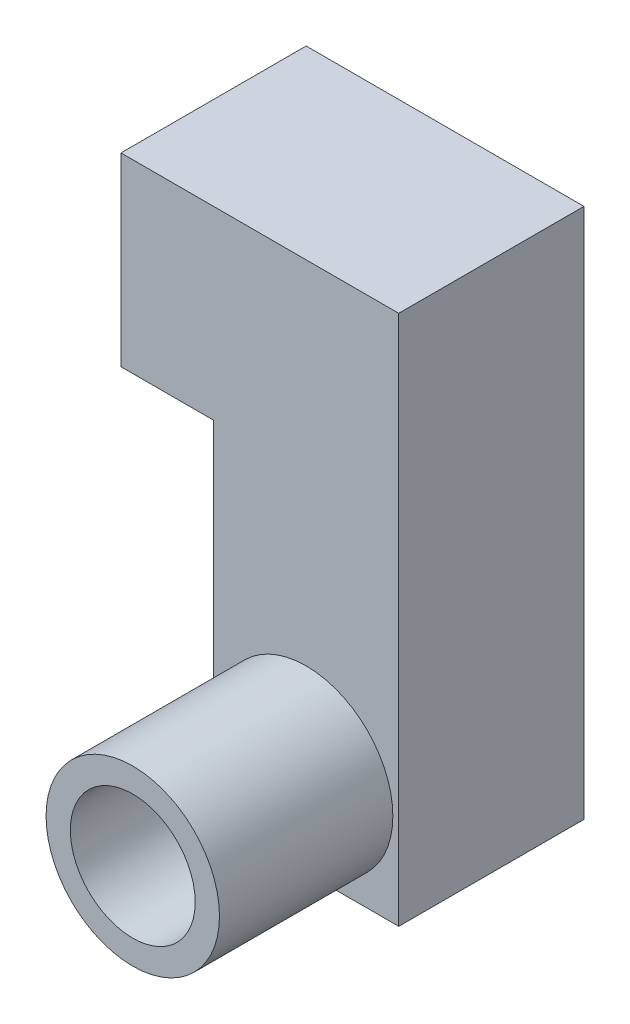
ISO-10303-21;
HEADER;
FILE_DESCRIPTION(('STEP AP214'),'2;1');
FILE_NAME('part.step','',(''),(''),'','','');
FILE_SCHEMA(('AUTOMOTIVE_DESIGN { 1 0 10303 214 1 1 1 1 }'));
ENDSEC;
DATA;
#1=APPLICATION_CONTEXT('core data for automotive mechanical design processes');
#2=APPLICATION_PROTOCOL_DEFINITION('international standard','automotive_design',2000,#1);
#3=PRODUCT_CONTEXT('',#1,'mechanical');
#4=PRODUCT('Part','Part','',(#3));
#5=PRODUCT_RELATED_PRODUCT_CATEGORY('part','',(#4));
#6=PRODUCT_DEFINITION_FORMATION('','',#4);
#7=PRODUCT_DEFINITION_CONTEXT('part definition',#1,'design');
#8=PRODUCT_DEFINITION('design','',#6,#7);
#9=PRODUCT_DEFINITION_SHAPE('','',#8);
#10=(LENGTH_UNIT() NAMED_UNIT(*) SI_UNIT(.MILLI.,.METRE.));
#11=(NAMED_UNIT(*) PLANE_ANGLE_UNIT() SI_UNIT($,.RADIAN.));
#12=(NAMED_UNIT(*) SI_UNIT($,.STERADIAN.) SOLID_ANGLE_UNIT());
#13=UNCERTAINTY_MEASURE_WITH_UNIT(LENGTH_MEASURE(1.E-05),#10,'distance_accuracy_value','');
#14=(GEOMETRIC_REPRESENTATION_CONTEXT(3) GLOBAL_UNCERTAINTY_ASSIGNED_CONTEXT((#13)) GLOBAL_UNIT_ASSIGNED_CONTEXT((#10,
#11,#12)) REPRESENTATION_CONTEXT('',''));
#15=CARTESIAN_POINT('',(0.,0.,0.));
#16=DIRECTION('',(0.,0.,1.));
#17=DIRECTION('',(1.,0.,0.));
#18=AXIS2_PLACEMENT_3D('',#15,#16,#17);
#19=CARTESIAN_POINT('',(0.,0.,-9.65));
#20=DIRECTION('',(0.,0.,1.));
#21=DIRECTION('',(1.,0.,0.));
#22=AXIS2_PLACEMENT_3D('',#19,#20,#21);
#23=CYLINDRICAL_SURFACE('',#22,9.);
#24=CARTESIAN_POINT('',(0.,0.,-9.65));
#25=DIRECTION('',(0.,0.,1.));
#26=DIRECTION('',(1.,0.,0.));
#27=AXIS2_PLACEMENT_3D('',#24,#25,#26);
#28=CIRCLE('',#27,9.);
#29=CARTESIAN_POINT('',(9.,0.,-9.65));
#30=VERTEX_POINT('',#29);
#31=EDGE_CURVE('E106',#30,#30,#28,.T.);
#32=ORIENTED_EDGE('',*,*,#31,.F.);
#33=EDGE_LOOP('',(#32));
#34=FACE_BOUND('',#33,.T.);
#35=CARTESIAN_POINT('',(0.,0.,0.));
#36=DIRECTION('',(0.,-0.707106781186547,0.707106781186548));
#37=DIRECTION('',(0.,0.707106781186547,0.707106781186548));
#38=AXIS2_PLACEMENT_3D('',#35,#36,#37);
#39=ELLIPSE('',#38,12.7279220613579,9.);
#40=CARTESIAN_POINT('',(9.,0.,0.));
#41=VERTEX_POINT('',#40);
#42=CARTESIAN_POINT('',(-9.,0.,0.));
#43=VERTEX_POINT('',#42);
#44=EDGE_CURVE('E49',#41,#43,#39,.T.);
#45=ORIENTED_EDGE('',*,*,#44,.F.);
#46=CARTESIAN_POINT('',(0.,0.,0.));
#47=DIRECTION('',(0.,0.707106781186547,0.707106781186548));
#48=DIRECTION('',(0.,-0.707106781186547,0.707106781186548));
#49=AXIS2_PLACEMENT_3D('',#46,#47,#48);
#50=ELLIPSE('',#49,12.7279220613579,9.);
#51=EDGE_CURVE('E93',#43,#41,#50,.F.);
#52=ORIENTED_EDGE('',*,*,#51,.F.);
#53=EDGE_LOOP('',(#45,#52));
#54=FACE_BOUND('',#53,.T.);
#55=CARTESIAN_POINT('',(0.,0.,38.35));
#56=DIRECTION('',(0.,0.,1.));
#57=DIRECTION('',(1.,0.,0.));
#58=AXIS2_PLACEMENT_3D('',#55,#56,#57);
#59=CIRCLE('',#58,9.);
#60=CARTESIAN_POINT('',(9.,0.,38.35));
#61=VERTEX_POINT('',#60);
#62=EDGE_CURVE('E235',#61,#61,#59,.T.);
#63=ORIENTED_EDGE('',*,*,#62,.T.);
#64=EDGE_LOOP('',(#63));
#65=FACE_BOUND('',#64,.T.);
#66=ADVANCED_FACE('F33',(#34,#54,#65),#23,.F.);
#67=CARTESIAN_POINT('',(9.,49.85,0.));
#68=DIRECTION('',(-1.,0.,0.));
#69=DIRECTION('',(0.,0.,1.));
#70=AXIS2_PLACEMENT_3D('',#67,#68,#69);
#71=CYLINDRICAL_SURFACE('',#70,11.5);
#72=CARTESIAN_POINT('',(-26.7,49.85,0.));
#73=DIRECTION('',(-1.,0.,0.));
#74=DIRECTION('',(0.,0.,1.));
#75=AXIS2_PLACEMENT_3D('',#72,#73,#74);
#76=CIRCLE('',#75,11.5);
#77=CARTESIAN_POINT('',(-26.7,49.85,11.5));
#78=VERTEX_POINT('',#77);
#79=EDGE_CURVE('E98',#78,#78,#76,.T.);
#80=ORIENTED_EDGE('',*,*,#79,.T.);
#81=EDGE_LOOP('',(#80));
#82=FACE_BOUND('',#81,.T.);
#83=CARTESIAN_POINT('',(9.,49.85,0.));
#84=DIRECTION('',(-1.,0.,0.));
#85=DIRECTION('',(0.,0.,1.));
#86=AXIS2_PLACEMENT_3D('',#83,#84,#85);
#87=CIRCLE('',#86,11.5);
#88=CARTESIAN_POINT('',(9.,38.35,0.));
#89=VERTEX_POINT('',#88);
#90=EDGE_CURVE('E101',#89,#89,#87,.T.);
#91=ORIENTED_EDGE('',*,*,#90,.F.);
#92=CARTESIAN_POINT('',(9.,38.35,0.));
#93=CARTESIAN_POINT('',(8.99999822327962,38.3500017273557,-0.217410044293531));
#94=CARTESIAN_POINT('',(8.9921082363085,38.356179395316,-0.434854105228076));
#95=CARTESIAN_POINT('',(8.96067876108795,38.3807511021865,-0.8680039294442));
#96=CARTESIAN_POINT('',(8.93713098780956,38.3991516085811,-1.08370871122784));
#97=CARTESIAN_POINT('',(8.87473673951324,38.4477822528311,-1.51193537286686));
#98=CARTESIAN_POINT('',(8.83586279429362,38.4780336312354,-1.72445082231631));
#99=CARTESIAN_POINT('',(8.74345195587784,38.5496857802098,-2.14435944926959));
#100=CARTESIAN_POINT('',(8.68991328585942,38.5910879018273,-2.35175200274618));
#101=CARTESIAN_POINT('',(8.56936575250363,38.6838655463068,-2.75875568885037));
#102=CARTESIAN_POINT('',(8.50244563499903,38.73517528858,-2.95840825210157));
#103=CARTESIAN_POINT('',(8.35579785571749,38.8469501844156,-3.35028625690186));
#104=CARTESIAN_POINT('',(8.27607011048031,38.9074153976389,-3.54251165004205));
#105=CARTESIAN_POINT('',(8.10472310325604,39.0364271676711,-3.9186956043603));
#106=CARTESIAN_POINT('',(8.01310660716111,39.1049718444714,-4.10265607499532));
#107=CARTESIAN_POINT('',(7.81882657789371,39.2490658118712,-4.46179905239505));
#108=CARTESIAN_POINT('',(7.71616111297857,39.3246163270136,-4.63698001632511));
#109=CARTESIAN_POINT('',(7.46422450471424,39.5081012278483,-5.03568867218174));
#110=CARTESIAN_POINT('',(7.31091065032274,39.6183656730867,-5.25560239585202));
#111=CARTESIAN_POINT('',(6.98759893165346,39.8468282675425,-5.67840984854964));
#112=CARTESIAN_POINT('',(6.81759593873014,39.9650288520213,-5.88129830988823));
#113=CARTESIAN_POINT('',(6.46174549978959,40.2070191575241,-6.27020741821287));
#114=CARTESIAN_POINT('',(6.27585737854124,40.3308228202649,-6.45618208323662));
#115=CARTESIAN_POINT('',(5.88955328470478,40.580957024231,-6.81042198083761));
#116=CARTESIAN_POINT('',(5.68913885632187,40.7072872958369,-6.97868909115035));
#117=CARTESIAN_POINT('',(5.27131455769504,40.9613086273188,-7.29956272598475));
#118=CARTESIAN_POINT('',(5.05370340890739,41.0889934670811,-7.45191229867028));
#119=CARTESIAN_POINT('',(4.60413379339249,41.3404008852973,-7.73776118692178));
#120=CARTESIAN_POINT('',(4.37217108126137,41.4641222747182,-7.87125488593252));
#121=CARTESIAN_POINT('',(3.89450138359598,41.7029447391882,-8.11818310252985));
#122=CARTESIAN_POINT('',(3.64883594867451,41.8180696371537,-8.23167433845495));
#123=CARTESIAN_POINT('',(3.14334983784952,42.0347290989592,-8.43764514874121));
#124=CARTESIAN_POINT('',(2.88354118756377,42.1362749623841,-8.53014223832434));
#125=CARTESIAN_POINT('',(2.30172980331531,42.3359494620844,-8.70689246697032));
#126=CARTESIAN_POINT('',(1.97693179665871,42.4301961260895,-8.78668891952417));
#127=CARTESIAN_POINT('',(1.47854353347439,42.5417970323273,-8.87932913492585));
#128=CARTESIAN_POINT('',(1.31067432990204,42.5740232481013,-8.90569082028775));
#129=CARTESIAN_POINT('',(0.97192521897398,42.6273471370681,-8.9489931393993));
#130=CARTESIAN_POINT('',(0.801045336252289,42.6484449012725,-8.96593385019647));
#131=CARTESIAN_POINT('',(0.456249273516456,42.6786365309159,-8.99010167954104));
#132=CARTESIAN_POINT('',(0.28231996808326,42.6876400640612,-8.99725570818045));
#133=CARTESIAN_POINT('',(-0.0658512390041491,42.6929025873102,-9.00144261391038));
#134=CARTESIAN_POINT('',(-0.240093129293098,42.6891620317515,-8.99847585181575));
#135=CARTESIAN_POINT('',(-0.587537384649862,42.6691165851834,-8.98248707466986));
#136=CARTESIAN_POINT('',(-0.760738656370942,42.6528002351411,-8.96945588891841));
#137=CARTESIAN_POINT('',(-1.10459468243736,42.6083816528351,-8.93363131803587));
#138=CARTESIAN_POINT('',(-1.27524907370092,42.5802777564562,-8.91083655451517));
#139=CARTESIAN_POINT('',(-1.64384935153782,42.5073911743148,-8.85091568960958));
#140=CARTESIAN_POINT('',(-1.84107439426894,42.4604974155648,-8.8119303029541));
#141=CARTESIAN_POINT('',(-2.22939791743426,42.3543171716167,-8.72178736412067));
#142=CARTESIAN_POINT('',(-2.42049165109832,42.2950213397779,-8.67062062760294));
#143=CARTESIAN_POINT('',(-2.79624196471087,42.1663990217176,-8.55684844353546));
#144=CARTESIAN_POINT('',(-2.98088324312365,42.097050466842,-8.49421774765468));
#145=CARTESIAN_POINT('',(-3.34298929661035,41.9507495628851,-8.35833802595944));
#146=CARTESIAN_POINT('',(-3.52045599190692,41.8737992675941,-8.28509186567987));
#147=CARTESIAN_POINT('',(-3.94457121954456,41.6793128455082,-8.09417500121846));
#148=CARTESIAN_POINT('',(-4.18742743934862,41.5587775173978,-7.97110918316317));
#149=CARTESIAN_POINT('',(-4.6585845429893,41.311132523155,-7.70524473094757));
#150=CARTESIAN_POINT('',(-4.88687948915122,41.1840202129005,-7.56243812128428));
#151=CARTESIAN_POINT('',(-5.3291038985905,40.9271675307432,-7.25760518053624));
#152=CARTESIAN_POINT('',(-5.54301808143878,40.7974245482709,-7.0955588963212));
#153=CARTESIAN_POINT('',(-5.95585920791267,40.5389108143156,-6.75275584191947));
#154=CARTESIAN_POINT('',(-6.15478835231626,40.4101399225758,-6.57200182853687));
#155=CARTESIAN_POINT('',(-6.54046110644087,40.1543080216009,-6.18851011733427));
#156=CARTESIAN_POINT('',(-6.72691521610022,40.0273213894881,-5.98543074128885));
#157=CARTESIAN_POINT('',(-7.08233848484335,39.7805824971196,-5.5603265841912));
#158=CARTESIAN_POINT('',(-7.25130519935981,39.6608312492712,-5.33829916228086));
#159=CARTESIAN_POINT('',(-7.56963425080215,39.4318825132714,-4.87638410614829));
#160=CARTESIAN_POINT('',(-7.7190422047211,39.322660630275,-4.63654015203619));
#161=CARTESIAN_POINT('',(-7.9965798326417,39.1174998590699,-4.13951955947518));
#162=CARTESIAN_POINT('',(-8.12471960393703,39.0215546712286,-3.8823512279575));
#163=CARTESIAN_POINT('',(-8.32315078285114,38.8717508442888,-3.43029426688288));
#164=CARTESIAN_POINT('',(-8.39937148209499,38.81381371072,-3.239335375507));
#165=CARTESIAN_POINT('',(-8.53919628315862,38.7070276501395,-2.85040370549098));
#166=CARTESIAN_POINT('',(-8.60280349399444,38.6581764837722,-2.65243266944312));
#167=CARTESIAN_POINT('',(-8.71655884023474,38.5705015331626,-2.25059581911168));
#168=CARTESIAN_POINT('',(-8.76671402047508,38.5316725007261,-2.04673315249057));
#169=CARTESIAN_POINT('',(-8.85288139815737,38.4648004006865,-1.63427992592035));
#170=CARTESIAN_POINT('',(-8.88889317600263,38.4367576530841,-1.42568922589735));
#171=CARTESIAN_POINT('',(-8.94631885531201,38.3919767896688,-1.00437509238264));
#172=CARTESIAN_POINT('',(-8.96766947466362,38.3752876825362,-0.791637769259479));
#173=CARTESIAN_POINT('',(-8.99515770098875,38.3537924372683,-0.364580141720291));
#174=CARTESIAN_POINT('',(-9.00129534711287,38.3489862685523,-0.15025984137948));
#175=CARTESIAN_POINT('',(-8.99824994733469,38.3513695862235,0.278201989323271));
#176=CARTESIAN_POINT('',(-8.98906700809433,38.3585589890974,0.492343520919415));
#177=CARTESIAN_POINT('',(-8.95554123795335,38.3847651821998,0.918696838539182));
#178=CARTESIAN_POINT('',(-8.93119890968259,38.4037815802884,1.13090868830731));
#179=CARTESIAN_POINT('',(-8.86983527886005,38.4515950663932,1.53805586020526));
#180=CARTESIAN_POINT('',(-8.83374183586908,38.4796753847994,1.73321698832034));
#181=CARTESIAN_POINT('',(-8.74915501028402,38.5452664785052,2.11928070833915));
#182=CARTESIAN_POINT('',(-8.70065742659841,38.5827804487651,2.31018183358206));
#183=CARTESIAN_POINT('',(-8.59189662755001,38.6665530641421,2.68657454312229));
#184=CARTESIAN_POINT('',(-8.53163605417228,38.7128097455594,2.87206733140744));
#185=CARTESIAN_POINT('',(-8.40000636502717,38.8133201589268,3.23690025733263));
#186=CARTESIAN_POINT('',(-8.3286331532052,38.8675768392383,3.4162380964273));
#187=CARTESIAN_POINT('',(-8.16944114998973,38.9878256811196,3.78194033549595));
#188=CARTESIAN_POINT('',(-8.08076842809534,39.0544064337438,3.96773988523801));
#189=CARTESIAN_POINT('',(-7.89219217774187,39.1948250361917,4.33072560665337));
#190=CARTESIAN_POINT('',(-7.79228402789785,39.2686658706693,4.5079081907347));
#191=CARTESIAN_POINT('',(-7.4769134293114,39.4994658115664,5.02583850180004));
#192=CARTESIAN_POINT('',(-7.24573743827164,39.6657539953712,5.35312142201973));
#193=CARTESIAN_POINT('',(-6.84776137270439,39.9439128627065,5.84502568708882));
#194=CARTESIAN_POINT('',(-6.69245138244429,40.0507798648588,6.02213828836098));
#195=CARTESIAN_POINT('',(-6.36973005899222,40.2682866175105,6.36250607494584));
#196=CARTESIAN_POINT('',(-6.20232034595706,40.3789258618613,6.52576310918189));
#197=CARTESIAN_POINT('',(-5.85578375664972,40.6021565814155,6.83844751591493));
#198=CARTESIAN_POINT('',(-5.67664087658417,40.7147505623563,6.98785529847694));
#199=CARTESIAN_POINT('',(-5.30719780503081,40.9396208204896,7.27241425781073));
#200=CARTESIAN_POINT('',(-5.11689853020065,41.0518971229916,7.40756660332381));
#201=CARTESIAN_POINT('',(-4.7339665055025,41.26881949623,7.65764384019224));
#202=CARTESIAN_POINT('',(-4.5418131758575,41.3735829311627,7.77320068099522));
#203=CARTESIAN_POINT('',(-4.14735202148846,41.5782353216533,7.99063159976031));
#204=CARTESIAN_POINT('',(-3.9450428252059,41.678123615207,8.09250382273701));
#205=CARTESIAN_POINT('',(-3.53055908235287,41.8699531615859,8.28172520474075));
#206=CARTESIAN_POINT('',(-3.318401459746,41.9619073240181,8.36909817787111));
#207=CARTESIAN_POINT('',(-2.88400419072257,42.1345726945945,8.52853965096908));
#208=CARTESIAN_POINT('',(-2.66176932522848,42.2152891617376,8.60061531808417));
#209=CARTESIAN_POINT('',(-2.276883455604,42.3392165304625,8.70877126139099));
#210=CARTESIAN_POINT('',(-2.11669515363759,42.3863637771984,8.74912922733228));
#211=CARTESIAN_POINT('',(-1.79212057882433,42.4718425163598,8.82133347516862));
#212=CARTESIAN_POINT('',(-1.62773566142404,42.5101768161987,8.85318246817005));
#213=CARTESIAN_POINT('',(-1.29571419337703,42.5765908611427,8.90782654202398));
#214=CARTESIAN_POINT('',(-1.1280839729709,42.6046887945693,8.93063768800681));
#215=CARTESIAN_POINT('',(-0.790287111423795,42.6495454718099,8.9668440449933));
#216=CARTESIAN_POINT('',(-0.620120514557297,42.6663044133186,8.98023942016066));
#217=CARTESIAN_POINT('',(-0.277512425625423,42.6877643171539,8.99736487174188));
#218=CARTESIAN_POINT('',(-0.105063422720433,42.6923929639187,9.00103698361138));
#219=CARTESIAN_POINT('',(0.239636820520633,42.689153556602,8.99845995381868));
#220=CARTESIAN_POINT('',(0.411888064602682,42.681285743273,8.99221100329223));
#221=CARTESIAN_POINT('',(0.754907326573375,42.6534293153126,8.96993220244685));
#222=CARTESIAN_POINT('',(0.925673922818449,42.6334301557009,8.95389384276361));
#223=CARTESIAN_POINT('',(1.26442749196011,42.5822146910776,8.91237201842384));
#224=CARTESIAN_POINT('',(1.43241268396803,42.5509914695116,8.88688272955747));
#225=CARTESIAN_POINT('',(1.80263135402717,42.4703119301917,8.82006453057125));
#226=CARTESIAN_POINT('',(2.0038979235533,42.4183175684991,8.77644498662975));
#227=CARTESIAN_POINT('',(2.39964267835402,42.3019905190722,8.67660145826646));
#228=CARTESIAN_POINT('',(2.59411765559347,42.2376520913096,8.62037160795138));
#229=CARTESIAN_POINT('',(2.97613092583807,42.0991558885264,8.49606292024981));
#230=CARTESIAN_POINT('',(3.1636528043133,42.0249765624278,8.42795797102546));
#231=CARTESIAN_POINT('',(3.53114107836026,41.8693198741245,8.28071447383764));
#232=CARTESIAN_POINT('',(3.71110705460803,41.7878421076682,8.20157531456761));
#233=CARTESIAN_POINT('',(4.13736097305636,41.5844454186232,7.99744521543848));
#234=CARTESIAN_POINT('',(4.37985179497391,41.4598830104322,7.86713395386661));
#235=CARTESIAN_POINT('',(4.8498712719954,41.2052178719098,7.5864161927396));
#236=CARTESIAN_POINT('',(5.07739422962559,41.0751130625719,7.43600210639465));
#237=CARTESIAN_POINT('',(5.51755289743778,40.8132922687875,7.11553030110103));
#238=CARTESIAN_POINT('',(5.73017498837814,40.6815749363903,6.94545497858939));
#239=CARTESIAN_POINT('',(6.13980948102416,40.4201312896554,6.5861180527072));
#240=CARTESIAN_POINT('',(6.33682414390881,40.2904046891077,6.39685923769997));
#241=CARTESIAN_POINT('',(6.71675316441322,40.0344597549335,5.99685413316648));
#242=CARTESIAN_POINT('',(6.89945837742554,39.9083062929339,5.78586697047258));
#243=CARTESIAN_POINT('',(7.24656106663897,39.6643524489799,5.34472752770593));
#244=CARTESIAN_POINT('',(7.41095575895618,39.5465533381856,5.1145723426484));
#245=CARTESIAN_POINT('',(7.71916187024204,39.3226891286964,4.63630151231458));
#246=CARTESIAN_POINT('',(7.86301801401662,39.2165986513275,4.38822672073711));
#247=CARTESIAN_POINT('',(8.1282518047661,39.0189956868033,3.87490160321312));
#248=CARTESIAN_POINT('',(8.24964212964913,38.9274749817379,3.60966107900191));
#249=CARTESIAN_POINT('',(8.43348578886847,38.7878427599313,3.14915671718566));
#250=CARTESIAN_POINT('',(8.50250906429106,38.7350980186159,2.95788983883604));
#251=CARTESIAN_POINT('',(8.62796638069054,38.6388367442332,2.56902711766217));
#252=CARTESIAN_POINT('',(8.68440363637338,38.5953178548504,2.37143290573727));
#253=CARTESIAN_POINT('',(8.78384121246647,38.5184124644177,1.97142583926735));
#254=CARTESIAN_POINT('',(8.82687046921928,38.4850041478834,1.76902439054147));
#255=CARTESIAN_POINT('',(8.89901276625649,38.42888305331,1.3603626975911));
#256=CARTESIAN_POINT('',(8.92813205352653,38.406165474115,1.15410422888957));
#257=CARTESIAN_POINT('',(8.96666467146521,38.3760742516814,0.789817456386888));
#258=CARTESIAN_POINT('',(8.97915275193157,38.3663090916397,0.632302154019254));
#259=CARTESIAN_POINT('',(8.99582197003391,38.3532706281381,0.316530680009573));
#260=CARTESIAN_POINT('',(9.00000129345115,38.3499987424863,0.158274354124511));
#261=CARTESIAN_POINT('',(9.,38.35,0.));
#262=B_SPLINE_CURVE_WITH_KNOTS('',3,(#92,#93,#94,#95,#96,#97,#98,#99,#100,#101,#102,#103,#104,
#105,#106,#107,#108,#109,#110,#111,#112,#113,#114,#115,#116,#117,#118,#119,#120,#121,#122,#123,
#124,#125,#126,#127,#128,#129,#130,#131,#132,#133,#134,#135,#136,#137,#138,#139,#140,#141,#142,
#143,#144,#145,#146,#147,#148,#149,#150,#151,#152,#153,#154,#155,#156,#157,#158,#159,#160,#161,
#162,#163,#164,#165,#166,#167,#168,#169,#170,#171,#172,#173,#174,#175,#176,#177,#178,#179,#180,
#181,#182,#183,#184,#185,#186,#187,#188,#189,#190,#191,#192,#193,#194,#195,#196,#197,#198,#199,
#200,#201,#202,#203,#204,#205,#206,#207,#208,#209,#210,#211,#212,#213,#214,#215,#216,#217,#218,
#219,#220,#221,#222,#223,#224,#225,#226,#227,#228,#229,#230,#231,#232,#233,#234,#235,#236,#237,
#238,#239,#240,#241,#242,#243,#244,#245,#246,#247,#248,#249,#250,#251,#252,#253,#254,#255,#256,
#257,#258,#259,#260,#261),.UNSPECIFIED.,.T.,.F.,(4,2,2,2,2,2,2,2,2,2,2,2,2,2,2,2,2,2,2,2,2,2,2,
2,2,2,2,2,2,2,2,2,2,2,2,2,2,2,2,2,2,2,2,2,2,2,2,2,2,2,2,2,2,2,2,2,2,2,2,2,2,2,2,2,2,2,2,2,2,2,2,
2,2,2,2,2,2,2,2,2,2,2,2,2,4),(0.,0.652060574257511,1.30446644919743,1.95804703350536,
2.61170684266298,3.2611673616546,3.91063211299322,4.55994603774714,5.20937367006877,
6.07776723833391,6.94642850813241,7.81738482952523,8.68824870014744,9.5715061903354,
10.4550262220532,11.335999190261,12.216234446894,13.2544001001623,13.772733819253,
14.2910632991957,14.8132430677243,15.3354042202916,15.8580417281189,16.3807530445117,
16.9991226508902,17.6179599725856,18.2381769952783,18.8582269075576,19.7502035043913,
20.6425415288563,21.5358132005783,22.428953425122,23.3384328572748,24.2480392545489,
25.1554848686031,26.0624984232811,26.7027340915754,27.3428117556906,27.9825535533386,
28.6223143289711,29.2648194405039,29.9073228985472,30.5498218834989,31.1922995666695,
31.7929805223404,32.3938651894222,32.9946150518737,33.5955868737838,34.2440552369011,
34.8927913120623,36.1897441064806,36.9652126016789,37.7405774530778,38.5170228449801,
39.2934045299395,40.0352880094714,40.7772719519706,41.5180249053842,42.2584300287185,
42.7733787069454,43.2881631173916,43.8020283281567,44.3158845794745,44.8327973229013,
45.3497001077871,45.8670528473579,46.3847249409858,47.0209494562772,47.6574705380913,
48.2954093179378,48.9333834543012,49.8386009104368,50.7441609647131,51.6505381793192,
52.5567838383891,53.4744578275427,54.3922711475589,55.3080543116916,56.2233190947808,
56.8529244163138,57.4823687401628,58.1104450727452,58.7382390696095,59.2128350766728,
59.687534700492),.UNSPECIFIED.);
#263=EDGE_CURVE('E55',#89,#89,#262,.T.);
#264=ORIENTED_EDGE('',*,*,#263,.F.);
#265=EDGE_LOOP('',(#91,#264));
#266=FACE_BOUND('',#265,.T.);
#267=ADVANCED_FACE('F188',(#82,#266),#71,.F.);
#268=CARTESIAN_POINT('',(-13.35,36.5,-13.35));
#269=DIRECTION('',(-1.,0.,0.));
#270=DIRECTION('',(0.,-1.,0.));
#271=AXIS2_PLACEMENT_3D('',#268,#269,#270);
#272=PLANE('',#271);
#273=DIRECTION('',(0.,-1.,0.));
#274=VECTOR('',#273,1.);
#275=CARTESIAN_POINT('',(-13.35,36.5,13.35));
#276=LINE('',#275,#274);
#277=CARTESIAN_POINT('',(-13.35,36.5,13.35));
#278=VERTEX_POINT('',#277);
#279=CARTESIAN_POINT('',(-13.35,-13.35,13.35));
#280=VERTEX_POINT('',#279);
#281=EDGE_CURVE('E114',#278,#280,#276,.T.);
#282=ORIENTED_EDGE('',*,*,#281,.F.);
#283=DIRECTION('',(0.,0.,1.));
#284=VECTOR('',#283,1.);
#285=CARTESIAN_POINT('',(-13.35,36.5,-13.35));
#286=LINE('',#285,#284);
#287=CARTESIAN_POINT('',(-13.35,36.5,-13.35));
#288=VERTEX_POINT('',#287);
#289=EDGE_CURVE('E147',#288,#278,#286,.T.);
#290=ORIENTED_EDGE('',*,*,#289,.F.);
#291=DIRECTION('',(0.,-1.,0.));
#292=VECTOR('',#291,1.);
#293=CARTESIAN_POINT('',(-13.35,36.5,-13.35));
#294=LINE('',#293,#292);
#295=CARTESIAN_POINT('',(-13.35,-13.35,-13.35));
#296=VERTEX_POINT('',#295);
#297=EDGE_CURVE('E126',#288,#296,#294,.T.);
#298=ORIENTED_EDGE('',*,*,#297,.T.);
#299=DIRECTION('',(0.,0.,1.));
#300=VECTOR('',#299,1.);
#301=CARTESIAN_POINT('',(-13.35,-13.35,-13.35));
#302=LINE('',#301,#300);
#303=EDGE_CURVE('E42',#296,#280,#302,.T.);
#304=ORIENTED_EDGE('',*,*,#303,.T.);
#305=EDGE_LOOP('',(#282,#290,#298,#304));
#306=FACE_BOUND('',#305,.T.);
#307=ADVANCED_FACE('F166',(#306),#272,.T.);
#308=CARTESIAN_POINT('',(-26.7,36.5,-13.35));
#309=DIRECTION('',(0.,-1.,0.));
#310=DIRECTION('',(0.,0.,-1.));
#311=AXIS2_PLACEMENT_3D('',#308,#309,#310);
#312=PLANE('',#311);
#313=DIRECTION('',(1.,0.,0.));
#314=VECTOR('',#313,1.);
#315=CARTESIAN_POINT('',(-26.7,36.5,13.35));
#316=LINE('',#315,#314);
#317=CARTESIAN_POINT('',(-26.7,36.5,13.35));
#318=VERTEX_POINT('',#317);
#319=EDGE_CURVE('E140',#318,#278,#316,.T.);
#320=ORIENTED_EDGE('',*,*,#319,.F.);
#321=DIRECTION('',(0.,0.,1.));
#322=VECTOR('',#321,1.);
#323=CARTESIAN_POINT('',(-26.7,36.5,-13.35));
#324=LINE('',#323,#322);
#325=CARTESIAN_POINT('',(-26.7,36.5,-13.35));
#326=VERTEX_POINT('',#325);
#327=EDGE_CURVE('E149',#326,#318,#324,.T.);
#328=ORIENTED_EDGE('',*,*,#327,.F.);
#329=DIRECTION('',(1.,0.,0.));
#330=VECTOR('',#329,1.);
#331=CARTESIAN_POINT('',(-26.7,36.5,-13.35));
#332=LINE('',#331,#330);
#333=EDGE_CURVE('E123',#326,#288,#332,.T.);
#334=ORIENTED_EDGE('',*,*,#333,.T.);
#335=ORIENTED_EDGE('',*,*,#289,.T.);
#336=EDGE_LOOP('',(#320,#328,#334,#335));
#337=FACE_BOUND('',#336,.T.);
#338=ADVANCED_FACE('F179',(#337),#312,.T.);
#339=CARTESIAN_POINT('',(-26.7,63.2,-13.35));
#340=DIRECTION('',(-1.,0.,0.));
#341=DIRECTION('',(0.,0.,1.));
#342=AXIS2_PLACEMENT_3D('',#339,#340,#341);
#343=PLANE('',#342);
#344=ORIENTED_EDGE('',*,*,#79,.F.);
#345=EDGE_LOOP('',(#344));
#346=FACE_BOUND('',#345,.T.);
#347=DIRECTION('',(0.,-1.,0.));
#348=VECTOR('',#347,1.);
#349=CARTESIAN_POINT('',(-26.7,63.2,13.35));
#350=LINE('',#349,#348);
#351=CARTESIAN_POINT('',(-26.7,63.2,13.35));
#352=VERTEX_POINT('',#351);
#353=EDGE_CURVE('E137',#352,#318,#350,.T.);
#354=ORIENTED_EDGE('',*,*,#353,.F.);
#355=DIRECTION('',(0.,0.,1.));
#356=VECTOR('',#355,1.);
#357=CARTESIAN_POINT('',(-26.7,63.2,-13.35));
#358=LINE('',#357,#356);
#359=CARTESIAN_POINT('',(-26.7,63.2,-13.35));
#360=VERTEX_POINT('',#359);
#361=EDGE_CURVE('E151',#360,#352,#358,.T.);
#362=ORIENTED_EDGE('',*,*,#361,.F.);
#363=DIRECTION('',(0.,-1.,0.));
#364=VECTOR('',#363,1.);
#365=CARTESIAN_POINT('',(-26.7,63.2,-13.35));
#366=LINE('',#365,#364);
#367=EDGE_CURVE('E120',#360,#326,#366,.T.);
#368=ORIENTED_EDGE('',*,*,#367,.T.);
#369=ORIENTED_EDGE('',*,*,#327,.T.);
#370=EDGE_LOOP('',(#354,#362,#368,#369));
#371=FACE_BOUND('',#370,.T.);
#372=ADVANCED_FACE('F177',(#346,#371),#343,.T.);
#373=CARTESIAN_POINT('',(13.35,63.2,-13.35));
#374=DIRECTION('',(0.,1.,0.));
#375=DIRECTION('',(0.,0.,1.));
#376=AXIS2_PLACEMENT_3D('',#373,#374,#375);
#377=PLANE('',#376);
#378=DIRECTION('',(-1.,0.,0.));
#379=VECTOR('',#378,1.);
#380=CARTESIAN_POINT('',(13.35,63.2,13.35));
#381=LINE('',#380,#379);
#382=CARTESIAN_POINT('',(13.35,63.2,13.35));
#383=VERTEX_POINT('',#382);
#384=EDGE_CURVE('E134',#383,#352,#381,.T.);
#385=ORIENTED_EDGE('',*,*,#384,.F.);
#386=DIRECTION('',(0.,0.,1.));
#387=VECTOR('',#386,1.);
#388=CARTESIAN_POINT('',(13.35,63.2,-13.35));
#389=LINE('',#388,#387);
#390=CARTESIAN_POINT('',(13.35,63.2,-13.35));
#391=VERTEX_POINT('',#390);
#392=EDGE_CURVE('E152',#391,#383,#389,.T.);
#393=ORIENTED_EDGE('',*,*,#392,.F.);
#394=DIRECTION('',(-1.,0.,0.));
#395=VECTOR('',#394,1.);
#396=CARTESIAN_POINT('',(13.35,63.2,-13.35));
#397=LINE('',#396,#395);
#398=EDGE_CURVE('E117',#391,#360,#397,.T.);
#399=ORIENTED_EDGE('',*,*,#398,.T.);
#400=ORIENTED_EDGE('',*,*,#361,.T.);
#401=EDGE_LOOP('',(#385,#393,#399,#400));
#402=FACE_BOUND('',#401,.T.);
#403=ADVANCED_FACE('F174',(#402),#377,.T.);
#404=CARTESIAN_POINT('',(13.35,-13.35,-13.35));
#405=DIRECTION('',(1.,0.,0.));
#406=DIRECTION('',(0.,1.,0.));
#407=AXIS2_PLACEMENT_3D('',#404,#405,#406);
#408=PLANE('',#407);
#409=DIRECTION('',(0.,1.,0.));
#410=VECTOR('',#409,1.);
#411=CARTESIAN_POINT('',(13.35,-13.35,13.35));
#412=LINE('',#411,#410);
#413=CARTESIAN_POINT('',(13.35,-13.35,13.35));
#414=VERTEX_POINT('',#413);
#415=EDGE_CURVE('E131',#414,#383,#412,.T.);
#416=ORIENTED_EDGE('',*,*,#415,.F.);
#417=DIRECTION('',(0.,0.,1.));
#418=VECTOR('',#417,1.);
#419=CARTESIAN_POINT('',(13.35,-13.35,-13.35));
#420=LINE('',#419,#418);
#421=CARTESIAN_POINT('',(13.35,-13.35,-13.35));
#422=VERTEX_POINT('',#421);
#423=EDGE_CURVE('E37',#422,#414,#420,.T.);
#424=ORIENTED_EDGE('',*,*,#423,.F.);
#425=DIRECTION('',(0.,1.,0.));
#426=VECTOR('',#425,1.);
#427=CARTESIAN_POINT('',(13.35,-13.35,-13.35));
#428=LINE('',#427,#426);
#429=EDGE_CURVE('E113',#422,#391,#428,.T.);
#430=ORIENTED_EDGE('',*,*,#429,.T.);
#431=ORIENTED_EDGE('',*,*,#392,.T.);
#432=EDGE_LOOP('',(#416,#424,#430,#431));
#433=FACE_BOUND('',#432,.T.);
#434=ADVANCED_FACE('F160',(#433),#408,.T.);
#435=CARTESIAN_POINT('',(0.,-13.35,-13.35));
#436=DIRECTION('',(0.,-1.,0.));
#437=DIRECTION('',(1.,0.,0.));
#438=AXIS2_PLACEMENT_3D('',#435,#436,#437);
#439=PLANE('',#438);
#440=DIRECTION('',(1.,0.,0.));
#441=VECTOR('',#440,1.);
#442=CARTESIAN_POINT('',(0.,-13.35,13.35));
#443=LINE('',#442,#441);
#444=EDGE_CURVE('E110',#280,#414,#443,.T.);
#445=ORIENTED_EDGE('',*,*,#444,.F.);
#446=ORIENTED_EDGE('',*,*,#303,.F.);
#447=DIRECTION('',(1.,0.,0.));
#448=VECTOR('',#447,1.);
#449=CARTESIAN_POINT('',(-13.35,-13.35,-13.35));
#450=LINE('',#449,#448);
#451=EDGE_CURVE('E111',#296,#422,#450,.T.);
#452=ORIENTED_EDGE('',*,*,#451,.T.);
#453=ORIENTED_EDGE('',*,*,#423,.T.);
#454=EDGE_LOOP('',(#445,#446,#452,#453));
#455=FACE_BOUND('',#454,.T.);
#456=ADVANCED_FACE('F35',(#455),#439,.T.);
#457=CARTESIAN_POINT('',(0.,0.,-13.35));
#458=DIRECTION('',(0.,0.,1.));
#459=DIRECTION('',(1.,0.,0.));
#460=AXIS2_PLACEMENT_3D('',#457,#458,#459);
#461=PLANE('',#460);
#462=ORIENTED_EDGE('',*,*,#451,.F.);
#463=ORIENTED_EDGE('',*,*,#297,.F.);
#464=ORIENTED_EDGE('',*,*,#333,.F.);
#465=ORIENTED_EDGE('',*,*,#367,.F.);
#466=ORIENTED_EDGE('',*,*,#398,.F.);
#467=ORIENTED_EDGE('',*,*,#429,.F.);
#468=EDGE_LOOP('',(#462,#463,#464,#465,#466,#467));
#469=FACE_BOUND('',#468,.T.);
#470=ADVANCED_FACE('F169',(#469),#461,.F.);
#471=CARTESIAN_POINT('',(0.,0.,13.35));
#472=DIRECTION('',(0.,0.,1.));
#473=DIRECTION('',(1.,0.,0.));
#474=AXIS2_PLACEMENT_3D('',#471,#472,#473);
#475=PLANE('',#474);
#476=CARTESIAN_POINT('',(0.,0.,13.35));
#477=DIRECTION('',(0.,0.,1.));
#478=DIRECTION('',(1.,0.,0.));
#479=AXIS2_PLACEMENT_3D('',#476,#477,#478);
#480=CIRCLE('',#479,12.5);
#481=CARTESIAN_POINT('',(12.5,0.,13.35));
#482=VERTEX_POINT('',#481);
#483=EDGE_CURVE('E11',#482,#482,#480,.T.);
#484=ORIENTED_EDGE('',*,*,#483,.F.);
#485=EDGE_LOOP('',(#484));
#486=FACE_BOUND('',#485,.T.);
#487=ORIENTED_EDGE('',*,*,#281,.T.);
#488=ORIENTED_EDGE('',*,*,#444,.T.);
#489=ORIENTED_EDGE('',*,*,#415,.T.);
#490=ORIENTED_EDGE('',*,*,#384,.T.);
#491=ORIENTED_EDGE('',*,*,#353,.T.);
#492=ORIENTED_EDGE('',*,*,#319,.T.);
#493=EDGE_LOOP('',(#487,#488,#489,#490,#491,#492));
#494=FACE_BOUND('',#493,.T.);
#495=ADVANCED_FACE('F162',(#486,#494),#475,.T.);
#496=CARTESIAN_POINT('',(0.,0.,-9.65));
#497=DIRECTION('',(0.,0.,1.));
#498=DIRECTION('',(1.,0.,0.));
#499=AXIS2_PLACEMENT_3D('',#496,#497,#498);
#500=PLANE('',#499);
#501=ORIENTED_EDGE('',*,*,#31,.T.);
#502=EDGE_LOOP('',(#501));
#503=FACE_BOUND('',#502,.T.);
#504=ADVANCED_FACE('F201',(#503),#500,.T.);
#505=CARTESIAN_POINT('',(9.,49.85,0.));
#506=DIRECTION('',(-1.,0.,0.));
#507=DIRECTION('',(0.,0.,1.));
#508=AXIS2_PLACEMENT_3D('',#505,#506,#507);
#509=PLANE('',#508);
#510=ORIENTED_EDGE('',*,*,#90,.T.);
#511=EDGE_LOOP('',(#510));
#512=FACE_BOUND('',#511,.T.);
#513=ADVANCED_FACE('F209',(#512),#509,.T.);
#514=CARTESIAN_POINT('',(0.,49.85,0.));
#515=DIRECTION('',(0.,-1.,0.));
#516=DIRECTION('',(0.,0.,-1.));
#517=AXIS2_PLACEMENT_3D('',#514,#515,#516);
#518=CYLINDRICAL_SURFACE('',#517,9.);
#519=ORIENTED_EDGE('',*,*,#263,.T.);
#520=EDGE_LOOP('',(#519));
#521=FACE_BOUND('',#520,.T.);
#522=ORIENTED_EDGE('',*,*,#44,.T.);
#523=ORIENTED_EDGE('',*,*,#51,.T.);
#524=EDGE_LOOP('',(#522,#523));
#525=FACE_BOUND('',#524,.T.);
#526=ADVANCED_FACE('F94',(#521,#525),#518,.F.);
#527=CARTESIAN_POINT('',(0.,0.,38.35));
#528=DIRECTION('',(0.,0.,1.));
#529=DIRECTION('',(1.,0.,0.));
#530=AXIS2_PLACEMENT_3D('',#527,#528,#529);
#531=PLANE('',#530);
#532=CARTESIAN_POINT('',(0.,0.,38.35));
#533=DIRECTION('',(0.,0.,1.));
#534=DIRECTION('',(1.,0.,0.));
#535=AXIS2_PLACEMENT_3D('',#532,#533,#534);
#536=CIRCLE('',#535,12.5);
#537=CARTESIAN_POINT('',(12.5,0.,38.35));
#538=VERTEX_POINT('',#537);
#539=EDGE_CURVE('E230',#538,#538,#536,.T.);
#540=ORIENTED_EDGE('',*,*,#539,.T.);
#541=EDGE_LOOP('',(#540));
#542=FACE_BOUND('',#541,.T.);
#543=ORIENTED_EDGE('',*,*,#62,.F.);
#544=EDGE_LOOP('',(#543));
#545=FACE_BOUND('',#544,.T.);
#546=ADVANCED_FACE('F215',(#542,#545),#531,.T.);
#547=CARTESIAN_POINT('',(0.,0.,38.35));
#548=DIRECTION('',(0.,0.,-1.));
#549=DIRECTION('',(-1.,0.,0.));
#550=AXIS2_PLACEMENT_3D('',#547,#548,#549);
#551=CYLINDRICAL_SURFACE('',#550,12.5);
#552=ORIENTED_EDGE('',*,*,#539,.F.);
#553=EDGE_LOOP('',(#552));
#554=FACE_BOUND('',#553,.T.);
#555=ORIENTED_EDGE('',*,*,#483,.T.);
#556=EDGE_LOOP('',(#555));
#557=FACE_BOUND('',#556,.T.);
#558=ADVANCED_FACE('F213',(#554,#557),#551,.T.);
#559=CLOSED_SHELL('',(#66,#267,#307,#338,#372,#403,#434,#456,#470,#495,#504,#513,#526,#546,#558));
#560=MANIFOLD_SOLID_BREP('B2',#559);
#561=ADVANCED_BREP_SHAPE_REPRESENTATION('',(#18,#560),#14);
#562=SHAPE_DEFINITION_REPRESENTATION(#9,#561);
ENDSEC;
END-ISO-10303-21;
